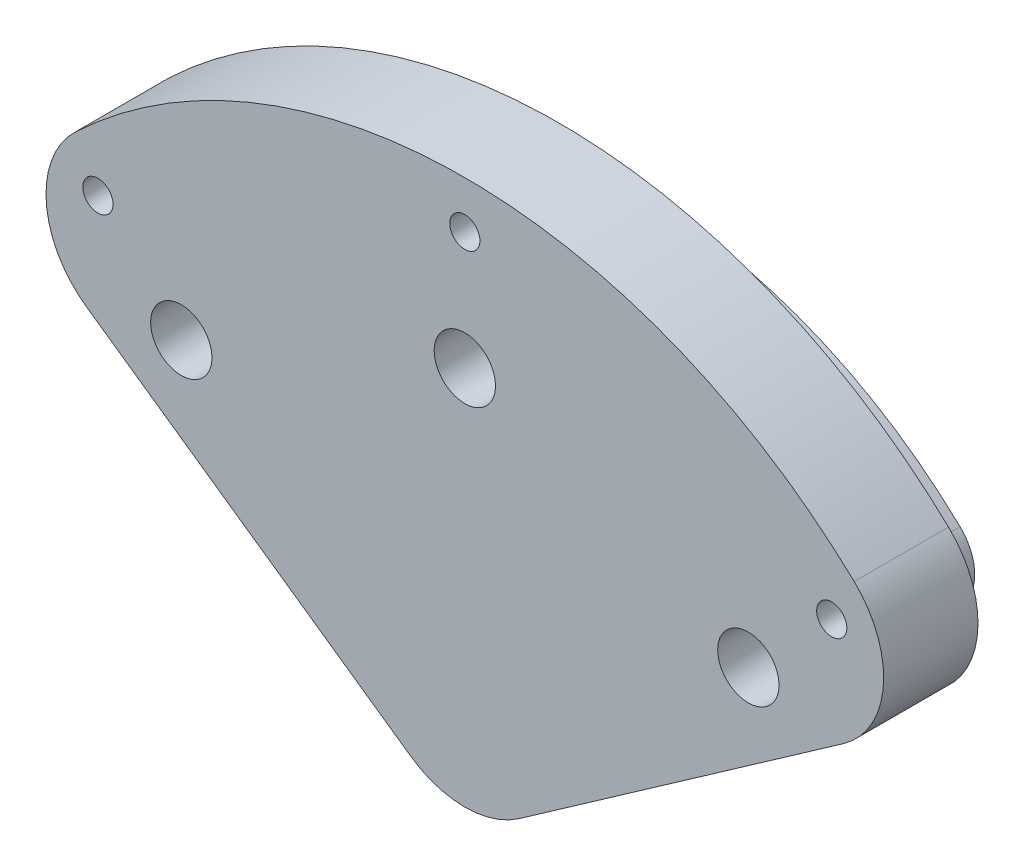
ISO-10303-21;
HEADER;
FILE_DESCRIPTION(('STEP AP214'),'2;1');
FILE_NAME('part.step','',(''),(''),'','','');
FILE_SCHEMA(('AUTOMOTIVE_DESIGN { 1 0 10303 214 1 1 1 1 }'));
ENDSEC;
DATA;
#1=APPLICATION_CONTEXT('core data for automotive mechanical design processes');
#2=APPLICATION_PROTOCOL_DEFINITION('international standard','automotive_design',2000,#1);
#3=PRODUCT_CONTEXT('',#1,'mechanical');
#4=PRODUCT('Part','Part','',(#3));
#5=PRODUCT_RELATED_PRODUCT_CATEGORY('part','',(#4));
#6=PRODUCT_DEFINITION_FORMATION('','',#4);
#7=PRODUCT_DEFINITION_CONTEXT('part definition',#1,'design');
#8=PRODUCT_DEFINITION('design','',#6,#7);
#9=PRODUCT_DEFINITION_SHAPE('','',#8);
#10=(LENGTH_UNIT() NAMED_UNIT(*) SI_UNIT(.MILLI.,.METRE.));
#11=(NAMED_UNIT(*) PLANE_ANGLE_UNIT() SI_UNIT($,.RADIAN.));
#12=(NAMED_UNIT(*) SI_UNIT($,.STERADIAN.) SOLID_ANGLE_UNIT());
#13=UNCERTAINTY_MEASURE_WITH_UNIT(LENGTH_MEASURE(1.E-05),#10,'distance_accuracy_value','');
#14=(GEOMETRIC_REPRESENTATION_CONTEXT(3) GLOBAL_UNCERTAINTY_ASSIGNED_CONTEXT((#13)) GLOBAL_UNIT_ASSIGNED_CONTEXT((#10,
#11,#12)) REPRESENTATION_CONTEXT('',''));
#15=CARTESIAN_POINT('',(0.,0.,0.));
#16=DIRECTION('',(0.,0.,1.));
#17=DIRECTION('',(1.,0.,0.));
#18=AXIS2_PLACEMENT_3D('',#15,#16,#17);
#19=CARTESIAN_POINT('',(38.8908729652601,38.8908729652601,0.));
#20=DIRECTION('',(0.,0.,-1.));
#21=DIRECTION('',(1.,0.,0.));
#22=AXIS2_PLACEMENT_3D('',#19,#20,#21);
#23=CYLINDRICAL_SURFACE('',#22,1.60000000000001);
#24=CARTESIAN_POINT('',(38.8908729652601,38.8908729652601,0.));
#25=DIRECTION('',(0.,0.,1.));
#26=DIRECTION('',(1.,0.,0.));
#27=AXIS2_PLACEMENT_3D('',#24,#25,#26);
#28=CIRCLE('',#27,1.60000000000001);
#29=CARTESIAN_POINT('',(40.4908729652601,38.8908729652601,0.));
#30=VERTEX_POINT('',#29);
#31=EDGE_CURVE('E335',#30,#30,#28,.T.);
#32=ORIENTED_EDGE('',*,*,#31,.T.);
#33=EDGE_LOOP('',(#32));
#34=FACE_BOUND('',#33,.T.);
#35=CARTESIAN_POINT('',(38.8908729652601,38.8908729652601,-6.));
#36=DIRECTION('',(0.,0.,1.));
#37=DIRECTION('',(1.,0.,0.));
#38=AXIS2_PLACEMENT_3D('',#35,#36,#37);
#39=CIRCLE('',#38,1.60000000000001);
#40=CARTESIAN_POINT('',(40.4908729652601,38.8908729652601,-6.));
#41=VERTEX_POINT('',#40);
#42=EDGE_CURVE('E53',#41,#41,#39,.F.);
#43=ORIENTED_EDGE('',*,*,#42,.T.);
#44=EDGE_LOOP('',(#43));
#45=FACE_BOUND('',#44,.T.);
#46=ADVANCED_FACE('F49',(#34,#45),#23,.F.);
#47=CARTESIAN_POINT('',(0.,55.,0.));
#48=DIRECTION('',(0.,0.,-1.));
#49=DIRECTION('',(1.,0.,0.));
#50=AXIS2_PLACEMENT_3D('',#47,#48,#49);
#51=CYLINDRICAL_SURFACE('',#50,1.6);
#52=CARTESIAN_POINT('',(0.,55.,0.));
#53=DIRECTION('',(0.,0.,1.));
#54=DIRECTION('',(1.,0.,0.));
#55=AXIS2_PLACEMENT_3D('',#52,#53,#54);
#56=CIRCLE('',#55,1.6);
#57=CARTESIAN_POINT('',(1.6,55.,0.));
#58=VERTEX_POINT('',#57);
#59=EDGE_CURVE('E193',#58,#58,#56,.T.);
#60=ORIENTED_EDGE('',*,*,#59,.T.);
#61=EDGE_LOOP('',(#60));
#62=FACE_BOUND('',#61,.T.);
#63=CARTESIAN_POINT('',(0.,55.,-6.));
#64=DIRECTION('',(0.,0.,1.));
#65=DIRECTION('',(1.,0.,0.));
#66=AXIS2_PLACEMENT_3D('',#63,#64,#65);
#67=CIRCLE('',#66,1.6);
#68=CARTESIAN_POINT('',(1.6,55.,-6.));
#69=VERTEX_POINT('',#68);
#70=EDGE_CURVE('E279',#69,#69,#67,.F.);
#71=ORIENTED_EDGE('',*,*,#70,.T.);
#72=EDGE_LOOP('',(#71));
#73=FACE_BOUND('',#72,.T.);
#74=ADVANCED_FACE('F391',(#62,#73),#51,.F.);
#75=CARTESIAN_POINT('',(-38.8908729652601,38.8908729652601,0.));
#76=DIRECTION('',(0.,0.,-1.));
#77=DIRECTION('',(1.,0.,0.));
#78=AXIS2_PLACEMENT_3D('',#75,#76,#77);
#79=CYLINDRICAL_SURFACE('',#78,1.6);
#80=CARTESIAN_POINT('',(-38.8908729652601,38.8908729652601,0.));
#81=DIRECTION('',(0.,0.,1.));
#82=DIRECTION('',(1.,0.,0.));
#83=AXIS2_PLACEMENT_3D('',#80,#81,#82);
#84=CIRCLE('',#83,1.6);
#85=CARTESIAN_POINT('',(-37.2908729652601,38.8908729652601,0.));
#86=VERTEX_POINT('',#85);
#87=EDGE_CURVE('E186',#86,#86,#84,.T.);
#88=ORIENTED_EDGE('',*,*,#87,.T.);
#89=EDGE_LOOP('',(#88));
#90=FACE_BOUND('',#89,.T.);
#91=CARTESIAN_POINT('',(-38.8908729652601,38.8908729652601,-6.));
#92=DIRECTION('',(0.,0.,1.));
#93=DIRECTION('',(1.,0.,0.));
#94=AXIS2_PLACEMENT_3D('',#91,#92,#93);
#95=CIRCLE('',#94,1.6);
#96=CARTESIAN_POINT('',(-37.2908729652601,38.8908729652601,-6.));
#97=VERTEX_POINT('',#96);
#98=EDGE_CURVE('E276',#97,#97,#95,.F.);
#99=ORIENTED_EDGE('',*,*,#98,.T.);
#100=EDGE_LOOP('',(#99));
#101=FACE_BOUND('',#100,.T.);
#102=ADVANCED_FACE('F397',(#90,#101),#79,.F.);
#103=CARTESIAN_POINT('',(30.0520382004283,30.0520382004283,-18.));
#104=DIRECTION('',(0.,0.,1.));
#105=DIRECTION('',(-1.,0.,0.));
#106=AXIS2_PLACEMENT_3D('',#103,#104,#105);
#107=CYLINDRICAL_SURFACE('',#106,1.85);
#108=CARTESIAN_POINT('',(30.0520382004283,30.0520382004283,-18.));
#109=DIRECTION('',(0.,0.,1.));
#110=DIRECTION('',(1.,0.,0.));
#111=AXIS2_PLACEMENT_3D('',#108,#109,#110);
#112=CIRCLE('',#111,1.85);
#113=CARTESIAN_POINT('',(31.9020382004283,30.0520382004283,-18.));
#114=VERTEX_POINT('',#113);
#115=EDGE_CURVE('E327',#114,#114,#112,.T.);
#116=ORIENTED_EDGE('',*,*,#115,.F.);
#117=EDGE_LOOP('',(#116));
#118=FACE_BOUND('',#117,.T.);
#119=CARTESIAN_POINT('',(30.0520382004283,30.0520382004283,-5.));
#120=DIRECTION('',(0.,0.,-1.));
#121=DIRECTION('',(-1.,0.,0.));
#122=AXIS2_PLACEMENT_3D('',#119,#120,#121);
#123=CIRCLE('',#122,1.85);
#124=CARTESIAN_POINT('',(28.2020382004283,30.0520382004283,-5.));
#125=VERTEX_POINT('',#124);
#126=EDGE_CURVE('E776',#125,#125,#123,.F.);
#127=ORIENTED_EDGE('',*,*,#126,.T.);
#128=EDGE_LOOP('',(#127));
#129=FACE_BOUND('',#128,.T.);
#130=ADVANCED_FACE('F651',(#118,#129),#107,.F.);
#131=CARTESIAN_POINT('',(-30.0520382004283,30.0520382004283,-18.));
#132=DIRECTION('',(0.,0.,1.));
#133=DIRECTION('',(-1.,0.,0.));
#134=AXIS2_PLACEMENT_3D('',#131,#132,#133);
#135=CYLINDRICAL_SURFACE('',#134,1.85);
#136=CARTESIAN_POINT('',(-30.0520382004283,30.0520382004283,-18.));
#137=DIRECTION('',(0.,0.,1.));
#138=DIRECTION('',(1.,0.,0.));
#139=AXIS2_PLACEMENT_3D('',#136,#137,#138);
#140=CIRCLE('',#139,1.85);
#141=CARTESIAN_POINT('',(-28.2020382004283,30.0520382004283,-18.));
#142=VERTEX_POINT('',#141);
#143=EDGE_CURVE('E306',#142,#142,#140,.T.);
#144=ORIENTED_EDGE('',*,*,#143,.F.);
#145=EDGE_LOOP('',(#144));
#146=FACE_BOUND('',#145,.T.);
#147=CARTESIAN_POINT('',(-30.0520382004283,30.0520382004283,-5.));
#148=DIRECTION('',(0.,0.,-1.));
#149=DIRECTION('',(-1.,0.,0.));
#150=AXIS2_PLACEMENT_3D('',#147,#148,#149);
#151=CIRCLE('',#150,1.85);
#152=CARTESIAN_POINT('',(-31.9020382004283,30.0520382004283,-5.));
#153=VERTEX_POINT('',#152);
#154=EDGE_CURVE('E298',#153,#153,#151,.T.);
#155=ORIENTED_EDGE('',*,*,#154,.F.);
#156=EDGE_LOOP('',(#155));
#157=FACE_BOUND('',#156,.T.);
#158=ADVANCED_FACE('F649',(#146,#157),#135,.F.);
#159=CARTESIAN_POINT('',(0.,42.5,-18.));
#160=DIRECTION('',(0.,0.,1.));
#161=DIRECTION('',(-1.,0.,0.));
#162=AXIS2_PLACEMENT_3D('',#159,#160,#161);
#163=CYLINDRICAL_SURFACE('',#162,1.85);
#164=CARTESIAN_POINT('',(0.,42.5,-18.));
#165=DIRECTION('',(0.,0.,1.));
#166=DIRECTION('',(1.,0.,0.));
#167=AXIS2_PLACEMENT_3D('',#164,#165,#166);
#168=CIRCLE('',#167,1.85);
#169=CARTESIAN_POINT('',(1.85,42.5,-18.));
#170=VERTEX_POINT('',#169);
#171=EDGE_CURVE('E331',#170,#170,#168,.T.);
#172=ORIENTED_EDGE('',*,*,#171,.F.);
#173=EDGE_LOOP('',(#172));
#174=FACE_BOUND('',#173,.T.);
#175=CARTESIAN_POINT('',(0.,42.5,-5.));
#176=DIRECTION('',(0.,0.,-1.));
#177=DIRECTION('',(-1.,0.,0.));
#178=AXIS2_PLACEMENT_3D('',#175,#176,#177);
#179=CIRCLE('',#178,1.85);
#180=CARTESIAN_POINT('',(-1.85,42.5,-5.));
#181=VERTEX_POINT('',#180);
#182=EDGE_CURVE('E762',#181,#181,#179,.F.);
#183=ORIENTED_EDGE('',*,*,#182,.T.);
#184=EDGE_LOOP('',(#183));
#185=FACE_BOUND('',#184,.T.);
#186=ADVANCED_FACE('F407',(#174,#185),#163,.F.);
#187=CARTESIAN_POINT('',(0.,0.,0.));
#188=DIRECTION('',(0.,0.,-1.));
#189=DIRECTION('',(1.,0.,0.));
#190=AXIS2_PLACEMENT_3D('',#187,#188,#189);
#191=PLANE('',#190);
#192=CARTESIAN_POINT('',(30.0520382004283,30.0520382004283,0.));
#193=DIRECTION('',(0.,0.,-1.));
#194=DIRECTION('',(-1.,0.,0.));
#195=AXIS2_PLACEMENT_3D('',#192,#193,#194);
#196=CIRCLE('',#195,3.25);
#197=CARTESIAN_POINT('',(26.8020382004283,30.0520382004283,0.));
#198=VERTEX_POINT('',#197);
#199=EDGE_CURVE('E768',#198,#198,#196,.T.);
#200=ORIENTED_EDGE('',*,*,#199,.T.);
#201=EDGE_LOOP('',(#200));
#202=FACE_BOUND('',#201,.T.);
#203=CARTESIAN_POINT('',(0.,42.5,0.));
#204=DIRECTION('',(0.,0.,-1.));
#205=DIRECTION('',(-1.,0.,0.));
#206=AXIS2_PLACEMENT_3D('',#203,#204,#205);
#207=CIRCLE('',#206,3.25);
#208=CARTESIAN_POINT('',(-3.25,42.5,0.));
#209=VERTEX_POINT('',#208);
#210=EDGE_CURVE('E764',#209,#209,#207,.T.);
#211=ORIENTED_EDGE('',*,*,#210,.T.);
#212=EDGE_LOOP('',(#211));
#213=FACE_BOUND('',#212,.T.);
#214=CARTESIAN_POINT('',(-30.0520382004283,30.0520382004283,0.));
#215=DIRECTION('',(0.,0.,-1.));
#216=DIRECTION('',(-1.,0.,0.));
#217=AXIS2_PLACEMENT_3D('',#214,#215,#216);
#218=CIRCLE('',#217,3.25);
#219=CARTESIAN_POINT('',(-33.3020382004283,30.0520382004283,0.));
#220=VERTEX_POINT('',#219);
#221=EDGE_CURVE('E292',#220,#220,#218,.T.);
#222=ORIENTED_EDGE('',*,*,#221,.T.);
#223=EDGE_LOOP('',(#222));
#224=FACE_BOUND('',#223,.T.);
#225=ORIENTED_EDGE('',*,*,#87,.F.);
#226=EDGE_LOOP('',(#225));
#227=FACE_BOUND('',#226,.T.);
#228=ORIENTED_EDGE('',*,*,#59,.F.);
#229=EDGE_LOOP('',(#228));
#230=FACE_BOUND('',#229,.T.);
#231=ORIENTED_EDGE('',*,*,#31,.F.);
#232=EDGE_LOOP('',(#231));
#233=FACE_BOUND('',#232,.T.);
#234=CARTESIAN_POINT('',(0.,0.,0.));
#235=DIRECTION('',(0.,0.,1.));
#236=DIRECTION('',(1.,0.,0.));
#237=AXIS2_PLACEMENT_3D('',#234,#235,#236);
#238=CIRCLE('',#237,60.);
#239=CARTESIAN_POINT('',(41.2731914901654,43.5490948725245,0.));
#240=VERTEX_POINT('',#239);
#241=CARTESIAN_POINT('',(-41.2731914901654,43.5490948725245,0.));
#242=VERTEX_POINT('',#241);
#243=EDGE_CURVE('E173',#240,#242,#238,.T.);
#244=ORIENTED_EDGE('',*,*,#243,.T.);
#245=CARTESIAN_POINT('',(-34.3943262418045,36.2909123937704,0.));
#246=DIRECTION('',(0.,0.,1.));
#247=DIRECTION('',(1.,0.,0.));
#248=AXIS2_PLACEMENT_3D('',#245,#246,#247);
#249=CIRCLE('',#248,10.);
#250=CARTESIAN_POINT('',(-40.130090605315,28.0993919508805,0.));
#251=VERTEX_POINT('',#250);
#252=EDGE_CURVE('E179',#251,#242,#249,.F.);
#253=ORIENTED_EDGE('',*,*,#252,.F.);
#254=DIRECTION('',(-0.819152044288989,0.57357643635105,0.));
#255=VECTOR('',#254,1.);
#256=CARTESIAN_POINT('',(0.,0.,0.));
#257=LINE('',#256,#255);
#258=CARTESIAN_POINT('',(-5.7357643635105,4.01622544472471,0.));
#259=VERTEX_POINT('',#258);
#260=EDGE_CURVE('E185',#259,#251,#257,.T.);
#261=ORIENTED_EDGE('',*,*,#260,.F.);
#262=CARTESIAN_POINT('',(0.,12.2077458876146,0.));
#263=DIRECTION('',(0.,0.,1.));
#264=DIRECTION('',(1.,0.,0.));
#265=AXIS2_PLACEMENT_3D('',#262,#263,#264);
#266=CIRCLE('',#265,10.);
#267=CARTESIAN_POINT('',(5.7357643635105,4.01622544472471,0.));
#268=VERTEX_POINT('',#267);
#269=EDGE_CURVE('E166',#268,#259,#266,.F.);
#270=ORIENTED_EDGE('',*,*,#269,.F.);
#271=DIRECTION('',(0.819152044288989,0.57357643635105,0.));
#272=VECTOR('',#271,1.);
#273=CARTESIAN_POINT('',(0.,0.,0.));
#274=LINE('',#273,#272);
#275=CARTESIAN_POINT('',(40.130090605315,28.0993919508805,0.));
#276=VERTEX_POINT('',#275);
#277=EDGE_CURVE('E176',#268,#276,#274,.T.);
#278=ORIENTED_EDGE('',*,*,#277,.T.);
#279=CARTESIAN_POINT('',(34.3943262418045,36.2909123937704,0.));
#280=DIRECTION('',(0.,0.,1.));
#281=DIRECTION('',(1.,0.,0.));
#282=AXIS2_PLACEMENT_3D('',#279,#280,#281);
#283=CIRCLE('',#282,10.);
#284=EDGE_CURVE('E158',#240,#276,#283,.F.);
#285=ORIENTED_EDGE('',*,*,#284,.F.);
#286=EDGE_LOOP('',(#244,#253,#261,#270,#278,#285));
#287=FACE_BOUND('',#286,.T.);
#288=ADVANCED_FACE('F171',(#202,#213,#224,#227,#230,#233,#287),#191,.F.);
#289=CARTESIAN_POINT('',(0.,0.,-10.));
#290=DIRECTION('',(0.,0.,1.));
#291=DIRECTION('',(-1.,0.,0.));
#292=AXIS2_PLACEMENT_3D('',#289,#290,#291);
#293=CYLINDRICAL_SURFACE('',#292,60.);
#294=CARTESIAN_POINT('',(0.,0.,-10.));
#295=DIRECTION('',(0.,0.,1.));
#296=DIRECTION('',(1.,0.,0.));
#297=AXIS2_PLACEMENT_3D('',#294,#295,#296);
#298=CIRCLE('',#297,60.);
#299=CARTESIAN_POINT('',(41.2731914901654,43.5490948725245,-10.));
#300=VERTEX_POINT('',#299);
#301=CARTESIAN_POINT('',(-41.2731914901654,43.5490948725245,-10.));
#302=VERTEX_POINT('',#301);
#303=EDGE_CURVE('E201',#300,#302,#298,.T.);
#304=ORIENTED_EDGE('',*,*,#303,.T.);
#305=DIRECTION('',(0.,0.,1.));
#306=VECTOR('',#305,1.);
#307=CARTESIAN_POINT('',(-41.2731914901654,43.5490948725245,-10.));
#308=LINE('',#307,#306);
#309=EDGE_CURVE('E167',#242,#302,#308,.F.);
#310=ORIENTED_EDGE('',*,*,#309,.F.);
#311=ORIENTED_EDGE('',*,*,#243,.F.);
#312=DIRECTION('',(0.,0.,1.));
#313=VECTOR('',#312,1.);
#314=CARTESIAN_POINT('',(41.2731914901654,43.5490948725245,-10.));
#315=LINE('',#314,#313);
#316=EDGE_CURVE('E154',#300,#240,#315,.T.);
#317=ORIENTED_EDGE('',*,*,#316,.F.);
#318=EDGE_LOOP('',(#304,#310,#311,#317));
#319=FACE_BOUND('',#318,.T.);
#320=ADVANCED_FACE('F181',(#319),#293,.T.);
#321=CARTESIAN_POINT('',(0.,0.,-10.));
#322=DIRECTION('',(-0.57357643635105,-0.819152044288989,0.));
#323=DIRECTION('',(0.819152044288989,-0.57357643635105,0.));
#324=AXIS2_PLACEMENT_3D('',#321,#322,#323);
#325=PLANE('',#324);
#326=DIRECTION('',(-0.819152044288989,0.57357643635105,0.));
#327=VECTOR('',#326,1.);
#328=CARTESIAN_POINT('',(0.,0.,-10.));
#329=LINE('',#328,#327);
#330=CARTESIAN_POINT('',(-5.7357643635105,4.01622544472471,-10.));
#331=VERTEX_POINT('',#330);
#332=CARTESIAN_POINT('',(-40.130090605315,28.0993919508805,-10.));
#333=VERTEX_POINT('',#332);
#334=EDGE_CURVE('E358',#331,#333,#329,.T.);
#335=ORIENTED_EDGE('',*,*,#334,.F.);
#336=DIRECTION('',(0.,0.,1.));
#337=VECTOR('',#336,1.);
#338=CARTESIAN_POINT('',(-5.7357643635105,4.01622544472471,-10.));
#339=LINE('',#338,#337);
#340=EDGE_CURVE('E222',#259,#331,#339,.F.);
#341=ORIENTED_EDGE('',*,*,#340,.F.);
#342=ORIENTED_EDGE('',*,*,#260,.T.);
#343=DIRECTION('',(0.,0.,-1.));
#344=VECTOR('',#343,1.);
#345=CARTESIAN_POINT('',(-40.130090605315,28.0993919508805,0.));
#346=LINE('',#345,#344);
#347=EDGE_CURVE('E226',#333,#251,#346,.F.);
#348=ORIENTED_EDGE('',*,*,#347,.F.);
#349=EDGE_LOOP('',(#335,#341,#342,#348));
#350=FACE_BOUND('',#349,.T.);
#351=ADVANCED_FACE('F375',(#350),#325,.T.);
#352=CARTESIAN_POINT('',(0.,0.,-10.));
#353=DIRECTION('',(-0.57357643635105,0.819152044288989,0.));
#354=DIRECTION('',(-0.819152044288989,-0.57357643635105,0.));
#355=AXIS2_PLACEMENT_3D('',#352,#353,#354);
#356=PLANE('',#355);
#357=ORIENTED_EDGE('',*,*,#277,.F.);
#358=DIRECTION('',(0.,0.,1.));
#359=VECTOR('',#358,1.);
#360=CARTESIAN_POINT('',(5.7357643635105,4.01622544472471,0.));
#361=LINE('',#360,#359);
#362=CARTESIAN_POINT('',(5.7357643635105,4.01622544472471,-10.));
#363=VERTEX_POINT('',#362);
#364=EDGE_CURVE('E178',#363,#268,#361,.T.);
#365=ORIENTED_EDGE('',*,*,#364,.F.);
#366=DIRECTION('',(0.819152044288989,0.57357643635105,0.));
#367=VECTOR('',#366,1.);
#368=CARTESIAN_POINT('',(0.,0.,-10.));
#369=LINE('',#368,#367);
#370=CARTESIAN_POINT('',(40.130090605315,28.0993919508805,-10.));
#371=VERTEX_POINT('',#370);
#372=EDGE_CURVE('E196',#363,#371,#369,.T.);
#373=ORIENTED_EDGE('',*,*,#372,.T.);
#374=DIRECTION('',(0.,0.,1.));
#375=VECTOR('',#374,1.);
#376=CARTESIAN_POINT('',(40.130090605315,28.0993919508805,-10.));
#377=LINE('',#376,#375);
#378=EDGE_CURVE('E211',#276,#371,#377,.F.);
#379=ORIENTED_EDGE('',*,*,#378,.F.);
#380=EDGE_LOOP('',(#357,#365,#373,#379));
#381=FACE_BOUND('',#380,.T.);
#382=ADVANCED_FACE('F368',(#381),#356,.F.);
#383=CARTESIAN_POINT('',(0.,0.,-10.));
#384=DIRECTION('',(0.,0.,-1.));
#385=DIRECTION('',(1.,0.,0.));
#386=AXIS2_PLACEMENT_3D('',#383,#384,#385);
#387=PLANE('',#386);
#388=CARTESIAN_POINT('',(-38.8908729652601,38.8908729652601,-10.));
#389=DIRECTION('',(0.,0.,1.));
#390=DIRECTION('',(1.,0.,0.));
#391=AXIS2_PLACEMENT_3D('',#388,#389,#390);
#392=CIRCLE('',#391,3.);
#393=CARTESIAN_POINT('',(-35.8908729652601,38.8908729652601,-10.));
#394=VERTEX_POINT('',#393);
#395=EDGE_CURVE('E798',#394,#394,#392,.T.);
#396=ORIENTED_EDGE('',*,*,#395,.T.);
#397=EDGE_LOOP('',(#396));
#398=FACE_BOUND('',#397,.T.);
#399=CARTESIAN_POINT('',(0.,55.,-10.));
#400=DIRECTION('',(0.,0.,1.));
#401=DIRECTION('',(1.,0.,0.));
#402=AXIS2_PLACEMENT_3D('',#399,#400,#401);
#403=CIRCLE('',#402,3.);
#404=CARTESIAN_POINT('',(3.,55.,-10.));
#405=VERTEX_POINT('',#404);
#406=EDGE_CURVE('E794',#405,#405,#403,.T.);
#407=ORIENTED_EDGE('',*,*,#406,.T.);
#408=EDGE_LOOP('',(#407));
#409=FACE_BOUND('',#408,.T.);
#410=CARTESIAN_POINT('',(38.8908729652601,38.8908729652601,-10.));
#411=DIRECTION('',(0.,0.,1.));
#412=DIRECTION('',(1.,0.,0.));
#413=AXIS2_PLACEMENT_3D('',#410,#411,#412);
#414=CIRCLE('',#413,3.);
#415=CARTESIAN_POINT('',(41.8908729652601,38.8908729652601,-10.));
#416=VERTEX_POINT('',#415);
#417=EDGE_CURVE('E786',#416,#416,#414,.T.);
#418=ORIENTED_EDGE('',*,*,#417,.T.);
#419=EDGE_LOOP('',(#418));
#420=FACE_BOUND('',#419,.T.);
#421=CARTESIAN_POINT('',(0.,0.,-10.));
#422=DIRECTION('',(0.,0.,1.));
#423=DIRECTION('',(1.,0.,0.));
#424=AXIS2_PLACEMENT_3D('',#421,#422,#423);
#425=CIRCLE('',#424,37.5);
#426=CARTESIAN_POINT('',(25.691345773208,27.3167485686248,-10.));
#427=VERTEX_POINT('',#426);
#428=CARTESIAN_POINT('',(-25.691345773208,27.3167485686248,-10.));
#429=VERTEX_POINT('',#428);
#430=EDGE_CURVE('E344',#427,#429,#425,.T.);
#431=ORIENTED_EDGE('',*,*,#430,.F.);
#432=CARTESIAN_POINT('',(29.1168585429691,30.9589817111081,-10.));
#433=DIRECTION('',(0.,0.,1.));
#434=DIRECTION('',(1.,0.,0.));
#435=AXIS2_PLACEMENT_3D('',#432,#433,#434);
#436=CIRCLE('',#435,5.);
#437=CARTESIAN_POINT('',(32.3307965914018,27.1287594955132,-10.));
#438=VERTEX_POINT('',#437);
#439=EDGE_CURVE('E266',#438,#427,#436,.F.);
#440=ORIENTED_EDGE('',*,*,#439,.F.);
#441=DIRECTION('',(0.766044443118974,0.642787609686544,0.));
#442=VECTOR('',#441,1.);
#443=CARTESIAN_POINT('',(0.,0.,-10.));
#444=LINE('',#443,#442);
#445=CARTESIAN_POINT('',(34.258548972,28.7463358070743,-10.));
#446=VERTEX_POINT('',#445);
#447=EDGE_CURVE('E311',#438,#446,#444,.T.);
#448=ORIENTED_EDGE('',*,*,#447,.T.);
#449=CARTESIAN_POINT('',(31.0446109235672,32.5765580226692,-10.));
#450=DIRECTION('',(0.,0.,1.));
#451=DIRECTION('',(1.,0.,0.));
#452=AXIS2_PLACEMENT_3D('',#449,#450,#451);
#453=CIRCLE('',#452,5.);
#454=CARTESIAN_POINT('',(34.4940121372969,36.1961755807435,-10.));
#455=VERTEX_POINT('',#454);
#456=EDGE_CURVE('E270',#455,#446,#453,.F.);
#457=ORIENTED_EDGE('',*,*,#456,.F.);
#458=CARTESIAN_POINT('',(0.,0.,-10.));
#459=DIRECTION('',(0.,0.,1.));
#460=DIRECTION('',(1.,0.,0.));
#461=AXIS2_PLACEMENT_3D('',#458,#459,#460);
#462=CIRCLE('',#461,50.);
#463=CARTESIAN_POINT('',(-34.4940121372969,36.1961755807435,-10.));
#464=VERTEX_POINT('',#463);
#465=EDGE_CURVE('E336',#455,#464,#462,.T.);
#466=ORIENTED_EDGE('',*,*,#465,.T.);
#467=CARTESIAN_POINT('',(-31.0446109235673,32.5765580226691,-10.));
#468=DIRECTION('',(0.,0.,1.));
#469=DIRECTION('',(1.,0.,0.));
#470=AXIS2_PLACEMENT_3D('',#467,#468,#469);
#471=CIRCLE('',#470,5.);
#472=CARTESIAN_POINT('',(-34.258548972,28.7463358070743,-10.));
#473=VERTEX_POINT('',#472);
#474=EDGE_CURVE('E59',#473,#464,#471,.F.);
#475=ORIENTED_EDGE('',*,*,#474,.F.);
#476=DIRECTION('',(-0.766044443118975,0.642787609686543,0.));
#477=VECTOR('',#476,1.);
#478=CARTESIAN_POINT('',(0.,0.,-10.));
#479=LINE('',#478,#477);
#480=CARTESIAN_POINT('',(-32.3307965914018,27.1287594955132,-10.));
#481=VERTEX_POINT('',#480);
#482=EDGE_CURVE('E340',#481,#473,#479,.T.);
#483=ORIENTED_EDGE('',*,*,#482,.F.);
#484=CARTESIAN_POINT('',(-29.1168585429691,30.9589817111081,-10.));
#485=DIRECTION('',(0.,0.,1.));
#486=DIRECTION('',(1.,0.,0.));
#487=AXIS2_PLACEMENT_3D('',#484,#485,#486);
#488=CIRCLE('',#487,5.);
#489=EDGE_CURVE('E11',#429,#481,#488,.F.);
#490=ORIENTED_EDGE('',*,*,#489,.F.);
#491=EDGE_LOOP('',(#431,#440,#448,#457,#466,#475,#483,#490));
#492=FACE_BOUND('',#491,.T.);
#493=ORIENTED_EDGE('',*,*,#372,.F.);
#494=CARTESIAN_POINT('',(0.,12.2077458876146,-10.));
#495=DIRECTION('',(0.,0.,1.));
#496=DIRECTION('',(1.,0.,0.));
#497=AXIS2_PLACEMENT_3D('',#494,#495,#496);
#498=CIRCLE('',#497,10.);
#499=EDGE_CURVE('E214',#331,#363,#498,.T.);
#500=ORIENTED_EDGE('',*,*,#499,.F.);
#501=ORIENTED_EDGE('',*,*,#334,.T.);
#502=CARTESIAN_POINT('',(-34.3943262418045,36.2909123937704,-10.));
#503=DIRECTION('',(0.,0.,1.));
#504=DIRECTION('',(1.,0.,0.));
#505=AXIS2_PLACEMENT_3D('',#502,#503,#504);
#506=CIRCLE('',#505,10.);
#507=EDGE_CURVE('E217',#302,#333,#506,.T.);
#508=ORIENTED_EDGE('',*,*,#507,.F.);
#509=ORIENTED_EDGE('',*,*,#303,.F.);
#510=CARTESIAN_POINT('',(34.3943262418045,36.2909123937704,-10.));
#511=DIRECTION('',(0.,0.,1.));
#512=DIRECTION('',(1.,0.,0.));
#513=AXIS2_PLACEMENT_3D('',#510,#511,#512);
#514=CIRCLE('',#513,10.);
#515=EDGE_CURVE('E160',#371,#300,#514,.T.);
#516=ORIENTED_EDGE('',*,*,#515,.F.);
#517=EDGE_LOOP('',(#493,#500,#501,#508,#509,#516));
#518=FACE_BOUND('',#517,.T.);
#519=ADVANCED_FACE('F369',(#398,#409,#420,#492,#518),#387,.T.);
#520=CARTESIAN_POINT('',(34.3943262418045,36.2909123937704,-10.));
#521=DIRECTION('',(0.,0.,1.));
#522=DIRECTION('',(-1.,0.,0.));
#523=AXIS2_PLACEMENT_3D('',#520,#521,#522);
#524=CYLINDRICAL_SURFACE('',#523,10.);
#525=ORIENTED_EDGE('',*,*,#515,.T.);
#526=ORIENTED_EDGE('',*,*,#316,.T.);
#527=ORIENTED_EDGE('',*,*,#284,.T.);
#528=ORIENTED_EDGE('',*,*,#378,.T.);
#529=EDGE_LOOP('',(#525,#526,#527,#528));
#530=FACE_BOUND('',#529,.T.);
#531=ADVANCED_FACE('F156',(#530),#524,.T.);
#532=CARTESIAN_POINT('',(-34.3943262418045,36.2909123937704,-10.));
#533=DIRECTION('',(0.,0.,1.));
#534=DIRECTION('',(-1.,0.,0.));
#535=AXIS2_PLACEMENT_3D('',#532,#533,#534);
#536=CYLINDRICAL_SURFACE('',#535,10.);
#537=ORIENTED_EDGE('',*,*,#507,.T.);
#538=ORIENTED_EDGE('',*,*,#347,.T.);
#539=ORIENTED_EDGE('',*,*,#252,.T.);
#540=ORIENTED_EDGE('',*,*,#309,.T.);
#541=EDGE_LOOP('',(#537,#538,#539,#540));
#542=FACE_BOUND('',#541,.T.);
#543=ADVANCED_FACE('F372',(#542),#536,.T.);
#544=CARTESIAN_POINT('',(0.,12.2077458876146,-10.));
#545=DIRECTION('',(0.,0.,-1.));
#546=DIRECTION('',(1.,0.,0.));
#547=AXIS2_PLACEMENT_3D('',#544,#545,#546);
#548=CYLINDRICAL_SURFACE('',#547,10.);
#549=ORIENTED_EDGE('',*,*,#499,.T.);
#550=ORIENTED_EDGE('',*,*,#364,.T.);
#551=ORIENTED_EDGE('',*,*,#269,.T.);
#552=ORIENTED_EDGE('',*,*,#340,.T.);
#553=EDGE_LOOP('',(#549,#550,#551,#552));
#554=FACE_BOUND('',#553,.T.);
#555=ADVANCED_FACE('F377',(#554),#548,.T.);
#556=CARTESIAN_POINT('',(0.,0.,-18.));
#557=DIRECTION('',(0.,0.,1.));
#558=DIRECTION('',(-1.,0.,0.));
#559=AXIS2_PLACEMENT_3D('',#556,#557,#558);
#560=CYLINDRICAL_SURFACE('',#559,50.);
#561=CARTESIAN_POINT('',(0.,0.,-18.));
#562=DIRECTION('',(0.,0.,1.));
#563=DIRECTION('',(1.,0.,0.));
#564=AXIS2_PLACEMENT_3D('',#561,#562,#563);
#565=CIRCLE('',#564,50.);
#566=CARTESIAN_POINT('',(34.4940121372969,36.1961755807435,-18.));
#567=VERTEX_POINT('',#566);
#568=CARTESIAN_POINT('',(-34.4940121372969,36.1961755807435,-18.));
#569=VERTEX_POINT('',#568);
#570=EDGE_CURVE('E310',#567,#569,#565,.T.);
#571=ORIENTED_EDGE('',*,*,#570,.T.);
#572=DIRECTION('',(0.,0.,1.));
#573=VECTOR('',#572,1.);
#574=CARTESIAN_POINT('',(-34.4940121372969,36.1961755807435,-18.));
#575=LINE('',#574,#573);
#576=EDGE_CURVE('E255',#464,#569,#575,.F.);
#577=ORIENTED_EDGE('',*,*,#576,.F.);
#578=ORIENTED_EDGE('',*,*,#465,.F.);
#579=DIRECTION('',(0.,0.,1.));
#580=VECTOR('',#579,1.);
#581=CARTESIAN_POINT('',(34.4940121372969,36.1961755807435,-18.));
#582=LINE('',#581,#580);
#583=EDGE_CURVE('E259',#567,#455,#582,.T.);
#584=ORIENTED_EDGE('',*,*,#583,.F.);
#585=EDGE_LOOP('',(#571,#577,#578,#584));
#586=FACE_BOUND('',#585,.T.);
#587=ADVANCED_FACE('F379',(#586),#560,.T.);
#588=CARTESIAN_POINT('',(0.,0.,-18.));
#589=DIRECTION('',(-0.642787609686543,-0.766044443118975,0.));
#590=DIRECTION('',(0.766044443118975,-0.642787609686543,0.));
#591=AXIS2_PLACEMENT_3D('',#588,#589,#590);
#592=PLANE('',#591);
#593=DIRECTION('',(-0.766044443118975,0.642787609686543,0.));
#594=VECTOR('',#593,1.);
#595=CARTESIAN_POINT('',(0.,0.,-18.));
#596=LINE('',#595,#594);
#597=CARTESIAN_POINT('',(-32.3307965914018,27.1287594955132,-18.));
#598=VERTEX_POINT('',#597);
#599=CARTESIAN_POINT('',(-34.258548972,28.7463358070743,-18.));
#600=VERTEX_POINT('',#599);
#601=EDGE_CURVE('E315',#598,#600,#596,.T.);
#602=ORIENTED_EDGE('',*,*,#601,.F.);
#603=DIRECTION('',(0.,0.,1.));
#604=VECTOR('',#603,1.);
#605=CARTESIAN_POINT('',(-32.3307965914018,27.1287594955132,-18.));
#606=LINE('',#605,#604);
#607=EDGE_CURVE('E74',#481,#598,#606,.F.);
#608=ORIENTED_EDGE('',*,*,#607,.F.);
#609=ORIENTED_EDGE('',*,*,#482,.T.);
#610=DIRECTION('',(0.,0.,-1.));
#611=VECTOR('',#610,1.);
#612=CARTESIAN_POINT('',(-34.258548972,28.7463358070743,-10.));
#613=LINE('',#612,#611);
#614=EDGE_CURVE('E67',#600,#473,#613,.F.);
#615=ORIENTED_EDGE('',*,*,#614,.F.);
#616=EDGE_LOOP('',(#602,#608,#609,#615));
#617=FACE_BOUND('',#616,.T.);
#618=ADVANCED_FACE('F385',(#617),#592,.T.);
#619=CARTESIAN_POINT('',(0.,0.,-18.));
#620=DIRECTION('',(0.,0.,1.));
#621=DIRECTION('',(-1.,0.,0.));
#622=AXIS2_PLACEMENT_3D('',#619,#620,#621);
#623=CYLINDRICAL_SURFACE('',#622,37.5);
#624=ORIENTED_EDGE('',*,*,#430,.T.);
#625=DIRECTION('',(0.,0.,1.));
#626=VECTOR('',#625,1.);
#627=CARTESIAN_POINT('',(-25.6913457732081,27.3167485686248,-18.));
#628=LINE('',#627,#626);
#629=CARTESIAN_POINT('',(-25.691345773208,27.3167485686248,-18.));
#630=VERTEX_POINT('',#629);
#631=EDGE_CURVE('E236',#630,#429,#628,.T.);
#632=ORIENTED_EDGE('',*,*,#631,.F.);
#633=CARTESIAN_POINT('',(0.,0.,-18.));
#634=DIRECTION('',(0.,0.,1.));
#635=DIRECTION('',(1.,0.,0.));
#636=AXIS2_PLACEMENT_3D('',#633,#634,#635);
#637=CIRCLE('',#636,37.5);
#638=CARTESIAN_POINT('',(25.691345773208,27.3167485686248,-18.));
#639=VERTEX_POINT('',#638);
#640=EDGE_CURVE('E319',#639,#630,#637,.T.);
#641=ORIENTED_EDGE('',*,*,#640,.F.);
#642=DIRECTION('',(0.,0.,1.));
#643=VECTOR('',#642,1.);
#644=CARTESIAN_POINT('',(25.691345773208,27.3167485686248,-18.));
#645=LINE('',#644,#643);
#646=EDGE_CURVE('E239',#427,#639,#645,.F.);
#647=ORIENTED_EDGE('',*,*,#646,.F.);
#648=EDGE_LOOP('',(#624,#632,#641,#647));
#649=FACE_BOUND('',#648,.T.);
#650=ADVANCED_FACE('F446',(#649),#623,.F.);
#651=CARTESIAN_POINT('',(0.,0.,-18.));
#652=DIRECTION('',(-0.642787609686544,0.766044443118974,0.));
#653=DIRECTION('',(-0.766044443118974,-0.642787609686544,0.));
#654=AXIS2_PLACEMENT_3D('',#651,#652,#653);
#655=PLANE('',#654);
#656=DIRECTION('',(0.766044443118974,0.642787609686544,0.));
#657=VECTOR('',#656,1.);
#658=CARTESIAN_POINT('',(0.,0.,-18.));
#659=LINE('',#658,#657);
#660=CARTESIAN_POINT('',(32.3307965914018,27.1287594955132,-18.));
#661=VERTEX_POINT('',#660);
#662=CARTESIAN_POINT('',(34.258548972,28.7463358070743,-18.));
#663=VERTEX_POINT('',#662);
#664=EDGE_CURVE('E323',#661,#663,#659,.T.);
#665=ORIENTED_EDGE('',*,*,#664,.T.);
#666=DIRECTION('',(0.,0.,1.));
#667=VECTOR('',#666,1.);
#668=CARTESIAN_POINT('',(34.258548972,28.7463358070743,-18.));
#669=LINE('',#668,#667);
#670=EDGE_CURVE('E229',#446,#663,#669,.F.);
#671=ORIENTED_EDGE('',*,*,#670,.F.);
#672=ORIENTED_EDGE('',*,*,#447,.F.);
#673=DIRECTION('',(0.,0.,-1.));
#674=VECTOR('',#673,1.);
#675=CARTESIAN_POINT('',(32.3307965914018,27.1287594955132,-10.));
#676=LINE('',#675,#674);
#677=EDGE_CURVE('E233',#661,#438,#676,.F.);
#678=ORIENTED_EDGE('',*,*,#677,.F.);
#679=EDGE_LOOP('',(#665,#671,#672,#678));
#680=FACE_BOUND('',#679,.T.);
#681=ADVANCED_FACE('F455',(#680),#655,.F.);
#682=CARTESIAN_POINT('',(0.,0.,-18.));
#683=DIRECTION('',(0.,0.,-1.));
#684=DIRECTION('',(1.,0.,0.));
#685=AXIS2_PLACEMENT_3D('',#682,#683,#684);
#686=PLANE('',#685);
#687=ORIENTED_EDGE('',*,*,#143,.T.);
#688=EDGE_LOOP('',(#687));
#689=FACE_BOUND('',#688,.T.);
#690=ORIENTED_EDGE('',*,*,#640,.T.);
#691=CARTESIAN_POINT('',(-29.1168585429691,30.9589817111081,-18.));
#692=DIRECTION('',(0.,0.,1.));
#693=DIRECTION('',(1.,0.,0.));
#694=AXIS2_PLACEMENT_3D('',#691,#692,#693);
#695=CIRCLE('',#694,5.);
#696=EDGE_CURVE('E243',#598,#630,#695,.T.);
#697=ORIENTED_EDGE('',*,*,#696,.F.);
#698=ORIENTED_EDGE('',*,*,#601,.T.);
#699=CARTESIAN_POINT('',(-31.0446109235673,32.5765580226691,-18.));
#700=DIRECTION('',(0.,0.,1.));
#701=DIRECTION('',(1.,0.,0.));
#702=AXIS2_PLACEMENT_3D('',#699,#700,#701);
#703=CIRCLE('',#702,5.);
#704=EDGE_CURVE('E246',#569,#600,#703,.T.);
#705=ORIENTED_EDGE('',*,*,#704,.F.);
#706=ORIENTED_EDGE('',*,*,#570,.F.);
#707=CARTESIAN_POINT('',(31.0446109235672,32.5765580226692,-18.));
#708=DIRECTION('',(0.,0.,1.));
#709=DIRECTION('',(1.,0.,0.));
#710=AXIS2_PLACEMENT_3D('',#707,#708,#709);
#711=CIRCLE('',#710,5.);
#712=EDGE_CURVE('E249',#663,#567,#711,.T.);
#713=ORIENTED_EDGE('',*,*,#712,.F.);
#714=ORIENTED_EDGE('',*,*,#664,.F.);
#715=CARTESIAN_POINT('',(29.1168585429691,30.9589817111081,-18.));
#716=DIRECTION('',(0.,0.,1.));
#717=DIRECTION('',(1.,0.,0.));
#718=AXIS2_PLACEMENT_3D('',#715,#716,#717);
#719=CIRCLE('',#718,5.);
#720=EDGE_CURVE('E252',#639,#661,#719,.T.);
#721=ORIENTED_EDGE('',*,*,#720,.F.);
#722=EDGE_LOOP('',(#690,#697,#698,#705,#706,#713,#714,#721));
#723=FACE_BOUND('',#722,.T.);
#724=ORIENTED_EDGE('',*,*,#115,.T.);
#725=EDGE_LOOP('',(#724));
#726=FACE_BOUND('',#725,.T.);
#727=ORIENTED_EDGE('',*,*,#171,.T.);
#728=EDGE_LOOP('',(#727));
#729=FACE_BOUND('',#728,.T.);
#730=ADVANCED_FACE('F465',(#689,#723,#726,#729),#686,.T.);
#731=CARTESIAN_POINT('',(29.1168585429691,30.9589817111081,-18.));
#732=DIRECTION('',(0.,0.,1.));
#733=DIRECTION('',(-1.,0.,0.));
#734=AXIS2_PLACEMENT_3D('',#731,#732,#733);
#735=CYLINDRICAL_SURFACE('',#734,5.);
#736=ORIENTED_EDGE('',*,*,#720,.T.);
#737=ORIENTED_EDGE('',*,*,#677,.T.);
#738=ORIENTED_EDGE('',*,*,#439,.T.);
#739=ORIENTED_EDGE('',*,*,#646,.T.);
#740=EDGE_LOOP('',(#736,#737,#738,#739));
#741=FACE_BOUND('',#740,.T.);
#742=ADVANCED_FACE('F475',(#741),#735,.T.);
#743=CARTESIAN_POINT('',(31.0446109235672,32.5765580226692,-18.));
#744=DIRECTION('',(0.,0.,1.));
#745=DIRECTION('',(-1.,0.,0.));
#746=AXIS2_PLACEMENT_3D('',#743,#744,#745);
#747=CYLINDRICAL_SURFACE('',#746,5.);
#748=ORIENTED_EDGE('',*,*,#712,.T.);
#749=ORIENTED_EDGE('',*,*,#583,.T.);
#750=ORIENTED_EDGE('',*,*,#456,.T.);
#751=ORIENTED_EDGE('',*,*,#670,.T.);
#752=EDGE_LOOP('',(#748,#749,#750,#751));
#753=FACE_BOUND('',#752,.T.);
#754=ADVANCED_FACE('F494',(#753),#747,.T.);
#755=CARTESIAN_POINT('',(-31.0446109235673,32.5765580226691,-18.));
#756=DIRECTION('',(0.,0.,1.));
#757=DIRECTION('',(-1.,0.,0.));
#758=AXIS2_PLACEMENT_3D('',#755,#756,#757);
#759=CYLINDRICAL_SURFACE('',#758,5.);
#760=ORIENTED_EDGE('',*,*,#704,.T.);
#761=ORIENTED_EDGE('',*,*,#614,.T.);
#762=ORIENTED_EDGE('',*,*,#474,.T.);
#763=ORIENTED_EDGE('',*,*,#576,.T.);
#764=EDGE_LOOP('',(#760,#761,#762,#763));
#765=FACE_BOUND('',#764,.T.);
#766=ADVANCED_FACE('F503',(#765),#759,.T.);
#767=CARTESIAN_POINT('',(-29.1168585429691,30.9589817111081,-18.));
#768=DIRECTION('',(0.,0.,1.));
#769=DIRECTION('',(-1.,0.,0.));
#770=AXIS2_PLACEMENT_3D('',#767,#768,#769);
#771=CYLINDRICAL_SURFACE('',#770,5.);
#772=ORIENTED_EDGE('',*,*,#696,.T.);
#773=ORIENTED_EDGE('',*,*,#631,.T.);
#774=ORIENTED_EDGE('',*,*,#489,.T.);
#775=ORIENTED_EDGE('',*,*,#607,.T.);
#776=EDGE_LOOP('',(#772,#773,#774,#775));
#777=FACE_BOUND('',#776,.T.);
#778=ADVANCED_FACE('F51',(#777),#771,.T.);
#779=CARTESIAN_POINT('',(0.,42.5,-5.));
#780=DIRECTION('',(0.,0.,1.));
#781=DIRECTION('',(-1.,0.,0.));
#782=AXIS2_PLACEMENT_3D('',#779,#780,#781);
#783=CYLINDRICAL_SURFACE('',#782,3.25);
#784=CARTESIAN_POINT('',(0.,42.5,-5.));
#785=DIRECTION('',(0.,0.,-1.));
#786=DIRECTION('',(-1.,0.,0.));
#787=AXIS2_PLACEMENT_3D('',#784,#785,#786);
#788=CIRCLE('',#787,3.25);
#789=CARTESIAN_POINT('',(-3.25,42.5,-5.));
#790=VERTEX_POINT('',#789);
#791=EDGE_CURVE('E305',#790,#790,#788,.T.);
#792=ORIENTED_EDGE('',*,*,#791,.T.);
#793=EDGE_LOOP('',(#792));
#794=FACE_BOUND('',#793,.T.);
#795=ORIENTED_EDGE('',*,*,#210,.F.);
#796=EDGE_LOOP('',(#795));
#797=FACE_BOUND('',#796,.T.);
#798=ADVANCED_FACE('F520',(#794,#797),#783,.F.);
#799=CARTESIAN_POINT('',(0.,0.,-5.));
#800=DIRECTION('',(0.,0.,1.));
#801=DIRECTION('',(-1.,0.,0.));
#802=AXIS2_PLACEMENT_3D('',#799,#800,#801);
#803=PLANE('',#802);
#804=ORIENTED_EDGE('',*,*,#182,.F.);
#805=EDGE_LOOP('',(#804));
#806=FACE_BOUND('',#805,.T.);
#807=ORIENTED_EDGE('',*,*,#791,.F.);
#808=EDGE_LOOP('',(#807));
#809=FACE_BOUND('',#808,.T.);
#810=ADVANCED_FACE('F530',(#806,#809),#803,.T.);
#811=CARTESIAN_POINT('',(-30.0520382004283,30.0520382004283,-5.));
#812=DIRECTION('',(0.,0.,1.));
#813=DIRECTION('',(-1.,0.,0.));
#814=AXIS2_PLACEMENT_3D('',#811,#812,#813);
#815=CYLINDRICAL_SURFACE('',#814,3.25);
#816=CARTESIAN_POINT('',(-30.0520382004283,30.0520382004283,-5.));
#817=DIRECTION('',(0.,0.,-1.));
#818=DIRECTION('',(-1.,0.,0.));
#819=AXIS2_PLACEMENT_3D('',#816,#817,#818);
#820=CIRCLE('',#819,3.25);
#821=CARTESIAN_POINT('',(-33.3020382004283,30.0520382004283,-5.));
#822=VERTEX_POINT('',#821);
#823=EDGE_CURVE('E287',#822,#822,#820,.T.);
#824=ORIENTED_EDGE('',*,*,#823,.T.);
#825=EDGE_LOOP('',(#824));
#826=FACE_BOUND('',#825,.T.);
#827=ORIENTED_EDGE('',*,*,#221,.F.);
#828=EDGE_LOOP('',(#827));
#829=FACE_BOUND('',#828,.T.);
#830=ADVANCED_FACE('F541',(#826,#829),#815,.F.);
#831=CARTESIAN_POINT('',(-30.0520382004283,30.0520382004283,-5.));
#832=DIRECTION('',(0.,0.,1.));
#833=DIRECTION('',(-1.,0.,0.));
#834=AXIS2_PLACEMENT_3D('',#831,#832,#833);
#835=PLANE('',#834);
#836=ORIENTED_EDGE('',*,*,#154,.T.);
#837=EDGE_LOOP('',(#836));
#838=FACE_BOUND('',#837,.T.);
#839=ORIENTED_EDGE('',*,*,#823,.F.);
#840=EDGE_LOOP('',(#839));
#841=FACE_BOUND('',#840,.T.);
#842=ADVANCED_FACE('F551',(#838,#841),#835,.T.);
#843=CARTESIAN_POINT('',(30.0520382004283,30.0520382004283,-5.));
#844=DIRECTION('',(0.,0.,1.));
#845=DIRECTION('',(-1.,0.,0.));
#846=AXIS2_PLACEMENT_3D('',#843,#844,#845);
#847=CYLINDRICAL_SURFACE('',#846,3.25);
#848=CARTESIAN_POINT('',(30.0520382004283,30.0520382004283,-5.));
#849=DIRECTION('',(0.,0.,-1.));
#850=DIRECTION('',(-1.,0.,0.));
#851=AXIS2_PLACEMENT_3D('',#848,#849,#850);
#852=CIRCLE('',#851,3.25);
#853=CARTESIAN_POINT('',(26.8020382004283,30.0520382004283,-5.));
#854=VERTEX_POINT('',#853);
#855=EDGE_CURVE('E341',#854,#854,#852,.T.);
#856=ORIENTED_EDGE('',*,*,#855,.T.);
#857=EDGE_LOOP('',(#856));
#858=FACE_BOUND('',#857,.T.);
#859=ORIENTED_EDGE('',*,*,#199,.F.);
#860=EDGE_LOOP('',(#859));
#861=FACE_BOUND('',#860,.T.);
#862=ADVANCED_FACE('F560',(#858,#861),#847,.F.);
#863=CARTESIAN_POINT('',(0.,0.,-5.));
#864=DIRECTION('',(0.,0.,1.));
#865=DIRECTION('',(-1.,0.,0.));
#866=AXIS2_PLACEMENT_3D('',#863,#864,#865);
#867=PLANE('',#866);
#868=ORIENTED_EDGE('',*,*,#126,.F.);
#869=EDGE_LOOP('',(#868));
#870=FACE_BOUND('',#869,.T.);
#871=ORIENTED_EDGE('',*,*,#855,.F.);
#872=EDGE_LOOP('',(#871));
#873=FACE_BOUND('',#872,.T.);
#874=ADVANCED_FACE('F570',(#870,#873),#867,.T.);
#875=CARTESIAN_POINT('',(-38.8908729652601,38.8908729652601,-6.));
#876=DIRECTION('',(0.,0.,-1.));
#877=DIRECTION('',(1.,0.,0.));
#878=AXIS2_PLACEMENT_3D('',#875,#876,#877);
#879=PLANE('',#878);
#880=CARTESIAN_POINT('',(-38.8908729652601,38.8908729652601,-6.));
#881=DIRECTION('',(0.,0.,1.));
#882=DIRECTION('',(1.,0.,0.));
#883=AXIS2_PLACEMENT_3D('',#880,#881,#882);
#884=CIRCLE('',#883,3.);
#885=CARTESIAN_POINT('',(-35.8908729652601,38.8908729652601,-6.));
#886=VERTEX_POINT('',#885);
#887=EDGE_CURVE('E280',#886,#886,#884,.T.);
#888=ORIENTED_EDGE('',*,*,#887,.F.);
#889=EDGE_LOOP('',(#888));
#890=FACE_BOUND('',#889,.T.);
#891=ORIENTED_EDGE('',*,*,#98,.F.);
#892=EDGE_LOOP('',(#891));
#893=FACE_BOUND('',#892,.T.);
#894=ADVANCED_FACE('F580',(#890,#893),#879,.T.);
#895=CARTESIAN_POINT('',(-38.8908729652601,38.8908729652601,-6.));
#896=DIRECTION('',(0.,0.,-1.));
#897=DIRECTION('',(1.,0.,0.));
#898=AXIS2_PLACEMENT_3D('',#895,#896,#897);
#899=CYLINDRICAL_SURFACE('',#898,3.);
#900=ORIENTED_EDGE('',*,*,#887,.T.);
#901=EDGE_LOOP('',(#900));
#902=FACE_BOUND('',#901,.T.);
#903=ORIENTED_EDGE('',*,*,#395,.F.);
#904=EDGE_LOOP('',(#903));
#905=FACE_BOUND('',#904,.T.);
#906=ADVANCED_FACE('F591',(#902,#905),#899,.F.);
#907=CARTESIAN_POINT('',(0.,55.,-6.));
#908=DIRECTION('',(0.,0.,-1.));
#909=DIRECTION('',(1.,0.,0.));
#910=AXIS2_PLACEMENT_3D('',#907,#908,#909);
#911=PLANE('',#910);
#912=CARTESIAN_POINT('',(0.,55.,-6.));
#913=DIRECTION('',(0.,0.,1.));
#914=DIRECTION('',(1.,0.,0.));
#915=AXIS2_PLACEMENT_3D('',#912,#913,#914);
#916=CIRCLE('',#915,3.);
#917=CARTESIAN_POINT('',(3.,55.,-6.));
#918=VERTEX_POINT('',#917);
#919=EDGE_CURVE('E790',#918,#918,#916,.T.);
#920=ORIENTED_EDGE('',*,*,#919,.F.);
#921=EDGE_LOOP('',(#920));
#922=FACE_BOUND('',#921,.T.);
#923=ORIENTED_EDGE('',*,*,#70,.F.);
#924=EDGE_LOOP('',(#923));
#925=FACE_BOUND('',#924,.T.);
#926=ADVANCED_FACE('F601',(#922,#925),#911,.T.);
#927=CARTESIAN_POINT('',(0.,55.,-6.));
#928=DIRECTION('',(0.,0.,-1.));
#929=DIRECTION('',(1.,0.,0.));
#930=AXIS2_PLACEMENT_3D('',#927,#928,#929);
#931=CYLINDRICAL_SURFACE('',#930,3.);
#932=ORIENTED_EDGE('',*,*,#919,.T.);
#933=EDGE_LOOP('',(#932));
#934=FACE_BOUND('',#933,.T.);
#935=ORIENTED_EDGE('',*,*,#406,.F.);
#936=EDGE_LOOP('',(#935));
#937=FACE_BOUND('',#936,.T.);
#938=ADVANCED_FACE('F611',(#934,#937),#931,.F.);
#939=CARTESIAN_POINT('',(38.8908729652601,38.8908729652601,-6.));
#940=DIRECTION('',(0.,0.,-1.));
#941=DIRECTION('',(1.,0.,0.));
#942=AXIS2_PLACEMENT_3D('',#939,#940,#941);
#943=PLANE('',#942);
#944=CARTESIAN_POINT('',(38.8908729652601,38.8908729652601,-6.));
#945=DIRECTION('',(0.,0.,1.));
#946=DIRECTION('',(1.,0.,0.));
#947=AXIS2_PLACEMENT_3D('',#944,#945,#946);
#948=CIRCLE('',#947,3.);
#949=CARTESIAN_POINT('',(41.8908729652601,38.8908729652601,-6.));
#950=VERTEX_POINT('',#949);
#951=EDGE_CURVE('E783',#950,#950,#948,.T.);
#952=ORIENTED_EDGE('',*,*,#951,.F.);
#953=EDGE_LOOP('',(#952));
#954=FACE_BOUND('',#953,.T.);
#955=ORIENTED_EDGE('',*,*,#42,.F.);
#956=EDGE_LOOP('',(#955));
#957=FACE_BOUND('',#956,.T.);
#958=ADVANCED_FACE('F621',(#954,#957),#943,.T.);
#959=CARTESIAN_POINT('',(38.8908729652601,38.8908729652601,-6.));
#960=DIRECTION('',(0.,0.,-1.));
#961=DIRECTION('',(1.,0.,0.));
#962=AXIS2_PLACEMENT_3D('',#959,#960,#961);
#963=CYLINDRICAL_SURFACE('',#962,3.);
#964=ORIENTED_EDGE('',*,*,#951,.T.);
#965=EDGE_LOOP('',(#964));
#966=FACE_BOUND('',#965,.T.);
#967=ORIENTED_EDGE('',*,*,#417,.F.);
#968=EDGE_LOOP('',(#967));
#969=FACE_BOUND('',#968,.T.);
#970=ADVANCED_FACE('F631',(#966,#969),#963,.F.);
#971=CLOSED_SHELL('',(#46,#74,#102,#130,#158,#186,#288,#320,#351,#382,#519,#531,#543,#555,#587,
#618,#650,#681,#730,#742,#754,#766,#778,#798,#810,#830,#842,#862,#874,#894,#906,#926,#938,#958,#970));
#972=MANIFOLD_SOLID_BREP('B2',#971);
#973=ADVANCED_BREP_SHAPE_REPRESENTATION('',(#18,#972),#14);
#974=SHAPE_DEFINITION_REPRESENTATION(#9,#973);
ENDSEC;
END-ISO-10303-21;
